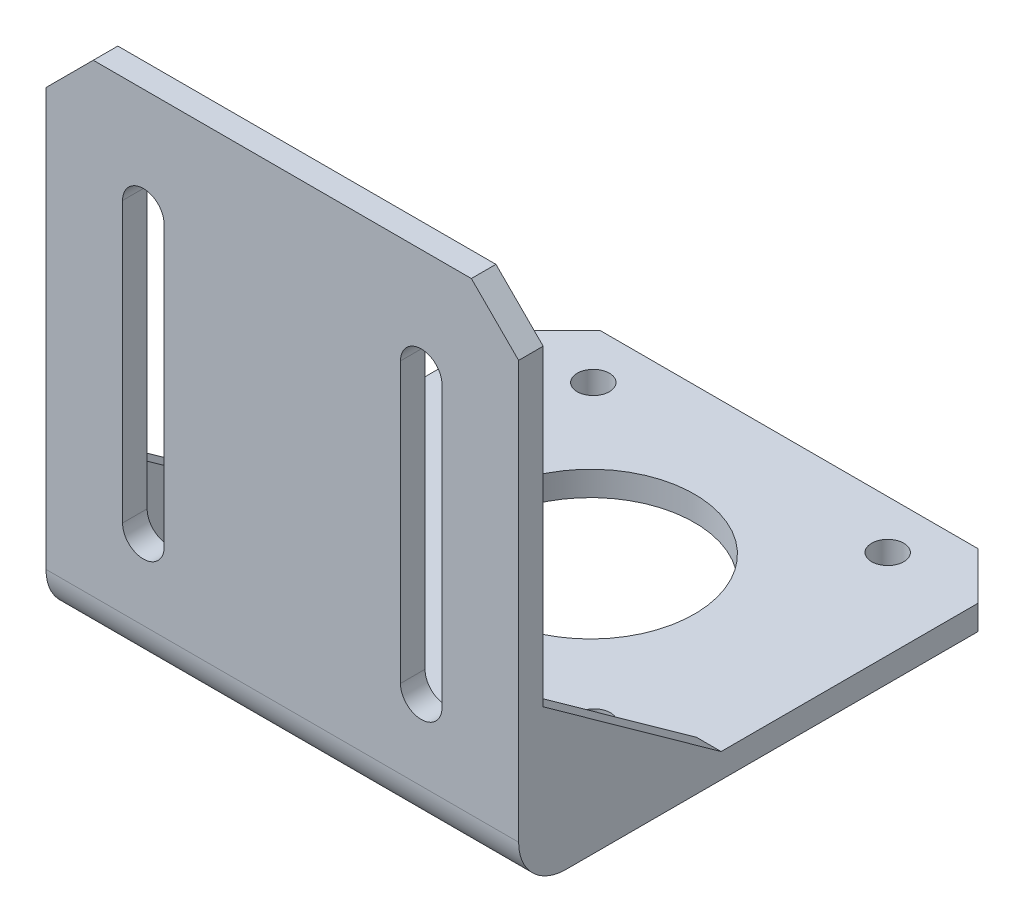
ISO-10303-21;
HEADER;
FILE_DESCRIPTION(('STEP AP214'),'2;1');
FILE_NAME('part.step','',(''),(''),'','','');
FILE_SCHEMA(('AUTOMOTIVE_DESIGN { 1 0 10303 214 1 1 1 1 }'));
ENDSEC;
DATA;
#1=APPLICATION_CONTEXT('core data for automotive mechanical design processes');
#2=APPLICATION_PROTOCOL_DEFINITION('international standard','automotive_design',2000,#1);
#3=PRODUCT_CONTEXT('',#1,'mechanical');
#4=PRODUCT('Part','Part','',(#3));
#5=PRODUCT_RELATED_PRODUCT_CATEGORY('part','',(#4));
#6=PRODUCT_DEFINITION_FORMATION('','',#4);
#7=PRODUCT_DEFINITION_CONTEXT('part definition',#1,'design');
#8=PRODUCT_DEFINITION('design','',#6,#7);
#9=PRODUCT_DEFINITION_SHAPE('','',#8);
#10=(LENGTH_UNIT() NAMED_UNIT(*) SI_UNIT(.MILLI.,.METRE.));
#11=(NAMED_UNIT(*) PLANE_ANGLE_UNIT() SI_UNIT($,.RADIAN.));
#12=(NAMED_UNIT(*) SI_UNIT($,.STERADIAN.) SOLID_ANGLE_UNIT());
#13=UNCERTAINTY_MEASURE_WITH_UNIT(LENGTH_MEASURE(1.E-05),#10,'distance_accuracy_value','');
#14=(GEOMETRIC_REPRESENTATION_CONTEXT(3) GLOBAL_UNCERTAINTY_ASSIGNED_CONTEXT((#13)) GLOBAL_UNIT_ASSIGNED_CONTEXT((#10,
#11,#12)) REPRESENTATION_CONTEXT('',''));
#15=CARTESIAN_POINT('',(0.,0.,0.));
#16=DIRECTION('',(0.,0.,1.));
#17=DIRECTION('',(1.,0.,0.));
#18=AXIS2_PLACEMENT_3D('',#15,#16,#17);
#19=CARTESIAN_POINT('',(0.,0.,0.));
#20=DIRECTION('',(0.,0.,-1.));
#21=DIRECTION('',(-1.,0.,0.));
#22=AXIS2_PLACEMENT_3D('',#19,#20,#21);
#23=PLANE('',#22);
#24=DIRECTION('',(0.,-1.,0.));
#25=VECTOR('',#24,1.);
#26=CARTESIAN_POINT('',(-16.9,15.775,0.));
#27=LINE('',#26,#25);
#28=CARTESIAN_POINT('',(-16.9,15.775,0.));
#29=VERTEX_POINT('',#28);
#30=CARTESIAN_POINT('',(-16.9,-13.775,0.));
#31=VERTEX_POINT('',#30);
#32=EDGE_CURVE('E298',#29,#31,#27,.T.);
#33=ORIENTED_EDGE('',*,*,#32,.T.);
#34=CARTESIAN_POINT('',(-14.7,-13.775,0.));
#35=DIRECTION('',(0.,0.,1.));
#36=DIRECTION('',(-1.,0.,0.));
#37=AXIS2_PLACEMENT_3D('',#34,#35,#36);
#38=CIRCLE('',#37,2.19999999999999);
#39=CARTESIAN_POINT('',(-12.5,-13.775,0.));
#40=VERTEX_POINT('',#39);
#41=EDGE_CURVE('E300',#31,#40,#38,.T.);
#42=ORIENTED_EDGE('',*,*,#41,.T.);
#43=DIRECTION('',(0.,1.,0.));
#44=VECTOR('',#43,1.);
#45=CARTESIAN_POINT('',(-12.5,15.775,0.));
#46=LINE('',#45,#44);
#47=CARTESIAN_POINT('',(-12.5,15.775,0.));
#48=VERTEX_POINT('',#47);
#49=EDGE_CURVE('E288',#40,#48,#46,.T.);
#50=ORIENTED_EDGE('',*,*,#49,.T.);
#51=CARTESIAN_POINT('',(-14.7,15.775,0.));
#52=DIRECTION('',(0.,0.,1.));
#53=DIRECTION('',(-1.,0.,0.));
#54=AXIS2_PLACEMENT_3D('',#51,#52,#53);
#55=CIRCLE('',#54,2.2);
#56=EDGE_CURVE('E284',#48,#29,#55,.T.);
#57=ORIENTED_EDGE('',*,*,#56,.T.);
#58=EDGE_LOOP('',(#33,#42,#50,#57));
#59=FACE_BOUND('',#58,.T.);
#60=DIRECTION('',(0.,-1.,0.));
#61=VECTOR('',#60,1.);
#62=CARTESIAN_POINT('',(12.5,15.775,0.));
#63=LINE('',#62,#61);
#64=CARTESIAN_POINT('',(12.5,15.775,0.));
#65=VERTEX_POINT('',#64);
#66=CARTESIAN_POINT('',(12.5,-13.775,0.));
#67=VERTEX_POINT('',#66);
#68=EDGE_CURVE('E328',#65,#67,#63,.T.);
#69=ORIENTED_EDGE('',*,*,#68,.T.);
#70=CARTESIAN_POINT('',(14.7,-13.775,0.));
#71=DIRECTION('',(0.,0.,1.));
#72=DIRECTION('',(1.,0.,0.));
#73=AXIS2_PLACEMENT_3D('',#70,#71,#72);
#74=CIRCLE('',#73,2.19999999999999);
#75=CARTESIAN_POINT('',(16.9,-13.775,0.));
#76=VERTEX_POINT('',#75);
#77=EDGE_CURVE('E330',#67,#76,#74,.T.);
#78=ORIENTED_EDGE('',*,*,#77,.T.);
#79=DIRECTION('',(0.,1.,0.));
#80=VECTOR('',#79,1.);
#81=CARTESIAN_POINT('',(16.9,15.775,0.));
#82=LINE('',#81,#80);
#83=CARTESIAN_POINT('',(16.9,15.775,0.));
#84=VERTEX_POINT('',#83);
#85=EDGE_CURVE('E318',#76,#84,#82,.T.);
#86=ORIENTED_EDGE('',*,*,#85,.T.);
#87=CARTESIAN_POINT('',(14.7,15.775,0.));
#88=DIRECTION('',(0.,0.,1.));
#89=DIRECTION('',(1.,0.,0.));
#90=AXIS2_PLACEMENT_3D('',#87,#88,#89);
#91=CIRCLE('',#90,2.2);
#92=EDGE_CURVE('E314',#84,#65,#91,.T.);
#93=ORIENTED_EDGE('',*,*,#92,.T.);
#94=EDGE_LOOP('',(#69,#78,#86,#93));
#95=FACE_BOUND('',#94,.T.);
#96=DIRECTION('',(0.,-1.,0.));
#97=VECTOR('',#96,1.);
#98=CARTESIAN_POINT('',(22.4,-9.97499999999999,0.));
#99=LINE('',#98,#97);
#100=CARTESIAN_POINT('',(22.4,-10.9658265989329,0.));
#101=VERTEX_POINT('',#100);
#102=CARTESIAN_POINT('',(22.4,-21.875,0.));
#103=VERTEX_POINT('',#102);
#104=EDGE_CURVE('E241',#101,#103,#99,.T.);
#105=ORIENTED_EDGE('',*,*,#104,.T.);
#106=DIRECTION('',(1.,0.,0.));
#107=VECTOR('',#106,1.);
#108=CARTESIAN_POINT('',(0.,-21.875,0.));
#109=LINE('',#108,#107);
#110=CARTESIAN_POINT('',(-22.4,-21.875,0.));
#111=VERTEX_POINT('',#110);
#112=EDGE_CURVE('E49',#103,#111,#109,.F.);
#113=ORIENTED_EDGE('',*,*,#112,.T.);
#114=DIRECTION('',(0.,-1.,0.));
#115=VECTOR('',#114,1.);
#116=CARTESIAN_POINT('',(-22.4,-9.97499999999999,0.));
#117=LINE('',#116,#115);
#118=CARTESIAN_POINT('',(-22.4,-10.9658265989329,0.));
#119=VERTEX_POINT('',#118);
#120=EDGE_CURVE('E246',#119,#111,#117,.T.);
#121=ORIENTED_EDGE('',*,*,#120,.F.);
#122=DIRECTION('',(-1.,0.,0.));
#123=VECTOR('',#122,1.);
#124=CARTESIAN_POINT('',(25.,-10.9658265989329,0.));
#125=LINE('',#124,#123);
#126=CARTESIAN_POINT('',(-25.,-10.9658265989329,0.));
#127=VERTEX_POINT('',#126);
#128=EDGE_CURVE('E224',#119,#127,#125,.T.);
#129=ORIENTED_EDGE('',*,*,#128,.T.);
#130=DIRECTION('',(0.,-1.,0.));
#131=VECTOR('',#130,1.);
#132=CARTESIAN_POINT('',(-25.,-27.075,0.));
#133=LINE('',#132,#131);
#134=CARTESIAN_POINT('',(-25.,22.075,0.));
#135=VERTEX_POINT('',#134);
#136=EDGE_CURVE('E344',#135,#127,#133,.T.);
#137=ORIENTED_EDGE('',*,*,#136,.F.);
#138=DIRECTION('',(-0.707106781186548,-0.707106781186547,0.));
#139=VECTOR('',#138,1.);
#140=CARTESIAN_POINT('',(-25.,22.075,0.));
#141=LINE('',#140,#139);
#142=CARTESIAN_POINT('',(-20.,27.075,0.));
#143=VERTEX_POINT('',#142);
#144=EDGE_CURVE('E349',#143,#135,#141,.T.);
#145=ORIENTED_EDGE('',*,*,#144,.F.);
#146=DIRECTION('',(-1.,0.,0.));
#147=VECTOR('',#146,1.);
#148=CARTESIAN_POINT('',(-20.,27.075,0.));
#149=LINE('',#148,#147);
#150=CARTESIAN_POINT('',(20.,27.075,0.));
#151=VERTEX_POINT('',#150);
#152=EDGE_CURVE('E363',#151,#143,#149,.T.);
#153=ORIENTED_EDGE('',*,*,#152,.F.);
#154=DIRECTION('',(-0.707106781186548,0.707106781186548,0.));
#155=VECTOR('',#154,1.);
#156=CARTESIAN_POINT('',(20.,27.075,0.));
#157=LINE('',#156,#155);
#158=CARTESIAN_POINT('',(25.,22.075,0.));
#159=VERTEX_POINT('',#158);
#160=EDGE_CURVE('E361',#159,#151,#157,.T.);
#161=ORIENTED_EDGE('',*,*,#160,.F.);
#162=DIRECTION('',(0.,1.,0.));
#163=VECTOR('',#162,1.);
#164=CARTESIAN_POINT('',(25.,-27.075,0.));
#165=LINE('',#164,#163);
#166=CARTESIAN_POINT('',(25.,-10.9658265989329,0.));
#167=VERTEX_POINT('',#166);
#168=EDGE_CURVE('E359',#167,#159,#165,.T.);
#169=ORIENTED_EDGE('',*,*,#168,.F.);
#170=EDGE_CURVE('E230',#167,#101,#125,.T.);
#171=ORIENTED_EDGE('',*,*,#170,.T.);
#172=EDGE_LOOP('',(#105,#113,#121,#129,#137,#145,#153,#161,#169,#171));
#173=FACE_BOUND('',#172,.T.);
#174=ADVANCED_FACE('F41',(#59,#95,#173),#23,.T.);
#175=CARTESIAN_POINT('',(25.,-24.475,-51.));
#176=DIRECTION('',(0.,-1.,0.));
#177=DIRECTION('',(0.,0.,-1.));
#178=AXIS2_PLACEMENT_3D('',#175,#176,#177);
#179=PLANE('',#178);
#180=CARTESIAN_POINT('',(0.,-24.475,-30.));
#181=DIRECTION('',(0.,1.,0.));
#182=DIRECTION('',(0.,0.,1.));
#183=AXIS2_PLACEMENT_3D('',#180,#181,#182);
#184=CIRCLE('',#183,11.);
#185=CARTESIAN_POINT('',(0.,-24.475,-19.));
#186=VERTEX_POINT('',#185);
#187=EDGE_CURVE('E252',#186,#186,#184,.T.);
#188=ORIENTED_EDGE('',*,*,#187,.F.);
#189=EDGE_LOOP('',(#188));
#190=FACE_BOUND('',#189,.T.);
#191=CARTESIAN_POINT('',(-15.575,-24.475,-14.725));
#192=DIRECTION('',(0.,1.,0.));
#193=DIRECTION('',(0.,0.,1.));
#194=AXIS2_PLACEMENT_3D('',#191,#192,#193);
#195=CIRCLE('',#194,1.7);
#196=CARTESIAN_POINT('',(-15.575,-24.475,-13.025));
#197=VERTEX_POINT('',#196);
#198=EDGE_CURVE('E268',#197,#197,#195,.T.);
#199=ORIENTED_EDGE('',*,*,#198,.F.);
#200=EDGE_LOOP('',(#199));
#201=FACE_BOUND('',#200,.T.);
#202=CARTESIAN_POINT('',(15.575,-24.475,-14.825));
#203=DIRECTION('',(0.,1.,0.));
#204=DIRECTION('',(0.,0.,1.));
#205=AXIS2_PLACEMENT_3D('',#202,#203,#204);
#206=CIRCLE('',#205,1.7);
#207=CARTESIAN_POINT('',(15.575,-24.475,-13.125));
#208=VERTEX_POINT('',#207);
#209=EDGE_CURVE('E262',#208,#208,#206,.T.);
#210=ORIENTED_EDGE('',*,*,#209,.F.);
#211=EDGE_LOOP('',(#210));
#212=FACE_BOUND('',#211,.T.);
#213=DIRECTION('',(0.,0.,-1.));
#214=VECTOR('',#213,1.);
#215=CARTESIAN_POINT('',(-22.4,-24.475,-20.));
#216=LINE('',#215,#214);
#217=CARTESIAN_POINT('',(-22.4,-24.475,-2.6));
#218=VERTEX_POINT('',#217);
#219=CARTESIAN_POINT('',(-22.4,-24.475,-18.8271899759138));
#220=VERTEX_POINT('',#219);
#221=EDGE_CURVE('E244',#218,#220,#216,.T.);
#222=ORIENTED_EDGE('',*,*,#221,.F.);
#223=DIRECTION('',(1.,0.,0.));
#224=VECTOR('',#223,1.);
#225=CARTESIAN_POINT('',(25.,-24.475,-2.6));
#226=LINE('',#225,#224);
#227=CARTESIAN_POINT('',(22.4,-24.475,-2.6));
#228=VERTEX_POINT('',#227);
#229=EDGE_CURVE('E410',#218,#228,#226,.T.);
#230=ORIENTED_EDGE('',*,*,#229,.T.);
#231=DIRECTION('',(0.,0.,1.));
#232=VECTOR('',#231,1.);
#233=CARTESIAN_POINT('',(22.4,-24.475,-20.));
#234=LINE('',#233,#232);
#235=CARTESIAN_POINT('',(22.4,-24.475,-18.8271899759138));
#236=VERTEX_POINT('',#235);
#237=EDGE_CURVE('E221',#236,#228,#234,.T.);
#238=ORIENTED_EDGE('',*,*,#237,.F.);
#239=DIRECTION('',(-1.,0.,0.));
#240=VECTOR('',#239,1.);
#241=CARTESIAN_POINT('',(25.,-24.475,-18.8271899759138));
#242=LINE('',#241,#240);
#243=CARTESIAN_POINT('',(25.,-24.475,-18.8271899759138));
#244=VERTEX_POINT('',#243);
#245=EDGE_CURVE('E216',#244,#236,#242,.T.);
#246=ORIENTED_EDGE('',*,*,#245,.F.);
#247=DIRECTION('',(0.,0.,1.));
#248=VECTOR('',#247,1.);
#249=CARTESIAN_POINT('',(25.,-24.475,-51.));
#250=LINE('',#249,#248);
#251=CARTESIAN_POINT('',(25.,-24.475,-46.));
#252=VERTEX_POINT('',#251);
#253=EDGE_CURVE('E202',#252,#244,#250,.T.);
#254=ORIENTED_EDGE('',*,*,#253,.F.);
#255=DIRECTION('',(-0.707106781186547,0.,-0.707106781186549));
#256=VECTOR('',#255,1.);
#257=CARTESIAN_POINT('',(20.,-24.475,-51.));
#258=LINE('',#257,#256);
#259=CARTESIAN_POINT('',(20.,-24.475,-51.));
#260=VERTEX_POINT('',#259);
#261=EDGE_CURVE('E397',#252,#260,#258,.T.);
#262=ORIENTED_EDGE('',*,*,#261,.T.);
#263=DIRECTION('',(1.,0.,0.));
#264=VECTOR('',#263,1.);
#265=CARTESIAN_POINT('',(25.,-24.475,-51.));
#266=LINE('',#265,#264);
#267=CARTESIAN_POINT('',(-20.,-24.475,-51.));
#268=VERTEX_POINT('',#267);
#269=EDGE_CURVE('E213',#268,#260,#266,.T.);
#270=ORIENTED_EDGE('',*,*,#269,.F.);
#271=DIRECTION('',(-0.707106781186547,0.,0.707106781186548));
#272=VECTOR('',#271,1.);
#273=CARTESIAN_POINT('',(-20.,-24.475,-51.));
#274=LINE('',#273,#272);
#275=CARTESIAN_POINT('',(-25.,-24.475,-46.));
#276=VERTEX_POINT('',#275);
#277=EDGE_CURVE('E399',#268,#276,#274,.T.);
#278=ORIENTED_EDGE('',*,*,#277,.T.);
#279=DIRECTION('',(0.,0.,1.));
#280=VECTOR('',#279,1.);
#281=CARTESIAN_POINT('',(-25.,-24.475,-51.));
#282=LINE('',#281,#280);
#283=CARTESIAN_POINT('',(-25.,-24.475,-18.8271899759138));
#284=VERTEX_POINT('',#283);
#285=EDGE_CURVE('E212',#276,#284,#282,.T.);
#286=ORIENTED_EDGE('',*,*,#285,.T.);
#287=EDGE_CURVE('E225',#220,#284,#242,.T.);
#288=ORIENTED_EDGE('',*,*,#287,.F.);
#289=EDGE_LOOP('',(#222,#230,#238,#246,#254,#262,#270,#278,#286,#288));
#290=FACE_BOUND('',#289,.T.);
#291=CARTESIAN_POINT('',(-15.575,-24.475,-45.875));
#292=DIRECTION('',(0.,1.,0.));
#293=DIRECTION('',(0.,0.,1.));
#294=AXIS2_PLACEMENT_3D('',#291,#292,#293);
#295=CIRCLE('',#294,1.7);
#296=CARTESIAN_POINT('',(-15.575,-24.475,-44.175));
#297=VERTEX_POINT('',#296);
#298=EDGE_CURVE('E249',#297,#297,#295,.T.);
#299=ORIENTED_EDGE('',*,*,#298,.F.);
#300=EDGE_LOOP('',(#299));
#301=FACE_BOUND('',#300,.T.);
#302=CARTESIAN_POINT('',(15.575,-24.475,-45.875));
#303=DIRECTION('',(0.,1.,0.));
#304=DIRECTION('',(0.,0.,1.));
#305=AXIS2_PLACEMENT_3D('',#302,#303,#304);
#306=CIRCLE('',#305,1.7);
#307=CARTESIAN_POINT('',(15.575,-24.475,-44.175));
#308=VERTEX_POINT('',#307);
#309=EDGE_CURVE('E256',#308,#308,#306,.T.);
#310=ORIENTED_EDGE('',*,*,#309,.F.);
#311=EDGE_LOOP('',(#310));
#312=FACE_BOUND('',#311,.T.);
#313=ADVANCED_FACE('F218',(#190,#201,#212,#290,#301,#312),#179,.F.);
#314=CARTESIAN_POINT('',(0.,0.,2.6));
#315=DIRECTION('',(0.,0.,-1.));
#316=DIRECTION('',(-1.,0.,0.));
#317=AXIS2_PLACEMENT_3D('',#314,#315,#316);
#318=PLANE('',#317);
#319=CARTESIAN_POINT('',(14.7,15.775,2.6));
#320=DIRECTION('',(0.,0.,1.));
#321=DIRECTION('',(1.,0.,0.));
#322=AXIS2_PLACEMENT_3D('',#319,#320,#321);
#323=CIRCLE('',#322,2.2);
#324=CARTESIAN_POINT('',(16.9,15.775,2.6));
#325=VERTEX_POINT('',#324);
#326=CARTESIAN_POINT('',(12.5,15.775,2.6));
#327=VERTEX_POINT('',#326);
#328=EDGE_CURVE('E315',#325,#327,#323,.T.);
#329=ORIENTED_EDGE('',*,*,#328,.F.);
#330=DIRECTION('',(0.,1.,0.));
#331=VECTOR('',#330,1.);
#332=CARTESIAN_POINT('',(16.9,15.775,2.6));
#333=LINE('',#332,#331);
#334=CARTESIAN_POINT('',(16.9,-13.775,2.6));
#335=VERTEX_POINT('',#334);
#336=EDGE_CURVE('E323',#335,#325,#333,.T.);
#337=ORIENTED_EDGE('',*,*,#336,.F.);
#338=CARTESIAN_POINT('',(14.7,-13.775,2.6));
#339=DIRECTION('',(0.,0.,1.));
#340=DIRECTION('',(1.,0.,0.));
#341=AXIS2_PLACEMENT_3D('',#338,#339,#340);
#342=CIRCLE('',#341,2.19999999999999);
#343=CARTESIAN_POINT('',(12.5,-13.775,2.6));
#344=VERTEX_POINT('',#343);
#345=EDGE_CURVE('E320',#344,#335,#342,.T.);
#346=ORIENTED_EDGE('',*,*,#345,.F.);
#347=DIRECTION('',(0.,-1.,0.));
#348=VECTOR('',#347,1.);
#349=CARTESIAN_POINT('',(12.5,15.775,2.6));
#350=LINE('',#349,#348);
#351=EDGE_CURVE('E317',#327,#344,#350,.T.);
#352=ORIENTED_EDGE('',*,*,#351,.F.);
#353=EDGE_LOOP('',(#329,#337,#346,#352));
#354=FACE_BOUND('',#353,.T.);
#355=DIRECTION('',(0.,-1.,0.));
#356=VECTOR('',#355,1.);
#357=CARTESIAN_POINT('',(-25.,-27.075,2.6));
#358=LINE('',#357,#356);
#359=CARTESIAN_POINT('',(-25.,22.075,2.6));
#360=VERTEX_POINT('',#359);
#361=CARTESIAN_POINT('',(-25.,-22.075,2.6));
#362=VERTEX_POINT('',#361);
#363=EDGE_CURVE('E345',#360,#362,#358,.T.);
#364=ORIENTED_EDGE('',*,*,#363,.T.);
#365=DIRECTION('',(1.,0.,0.));
#366=VECTOR('',#365,1.);
#367=CARTESIAN_POINT('',(0.,-22.075,2.6));
#368=LINE('',#367,#366);
#369=CARTESIAN_POINT('',(25.,-22.075,2.6));
#370=VERTEX_POINT('',#369);
#371=EDGE_CURVE('E382',#362,#370,#368,.T.);
#372=ORIENTED_EDGE('',*,*,#371,.T.);
#373=DIRECTION('',(0.,1.,0.));
#374=VECTOR('',#373,1.);
#375=CARTESIAN_POINT('',(25.,-27.075,2.6));
#376=LINE('',#375,#374);
#377=CARTESIAN_POINT('',(25.,22.075,2.6));
#378=VERTEX_POINT('',#377);
#379=EDGE_CURVE('E348',#370,#378,#376,.T.);
#380=ORIENTED_EDGE('',*,*,#379,.T.);
#381=DIRECTION('',(-0.707106781186548,0.707106781186548,0.));
#382=VECTOR('',#381,1.);
#383=CARTESIAN_POINT('',(20.,27.075,2.6));
#384=LINE('',#383,#382);
#385=CARTESIAN_POINT('',(20.,27.075,2.6));
#386=VERTEX_POINT('',#385);
#387=EDGE_CURVE('E351',#378,#386,#384,.T.);
#388=ORIENTED_EDGE('',*,*,#387,.T.);
#389=DIRECTION('',(-1.,0.,0.));
#390=VECTOR('',#389,1.);
#391=CARTESIAN_POINT('',(-20.,27.075,2.6));
#392=LINE('',#391,#390);
#393=CARTESIAN_POINT('',(-20.,27.075,2.6));
#394=VERTEX_POINT('',#393);
#395=EDGE_CURVE('E353',#386,#394,#392,.T.);
#396=ORIENTED_EDGE('',*,*,#395,.T.);
#397=DIRECTION('',(-0.707106781186548,-0.707106781186547,0.));
#398=VECTOR('',#397,1.);
#399=CARTESIAN_POINT('',(-25.,22.075,2.6));
#400=LINE('',#399,#398);
#401=EDGE_CURVE('E355',#394,#360,#400,.T.);
#402=ORIENTED_EDGE('',*,*,#401,.T.);
#403=EDGE_LOOP('',(#364,#372,#380,#388,#396,#402));
#404=FACE_BOUND('',#403,.T.);
#405=CARTESIAN_POINT('',(-14.7,15.775,2.6));
#406=DIRECTION('',(0.,0.,1.));
#407=DIRECTION('',(-1.,0.,0.));
#408=AXIS2_PLACEMENT_3D('',#405,#406,#407);
#409=CIRCLE('',#408,2.2);
#410=CARTESIAN_POINT('',(-12.5,15.775,2.6));
#411=VERTEX_POINT('',#410);
#412=CARTESIAN_POINT('',(-16.9,15.775,2.6));
#413=VERTEX_POINT('',#412);
#414=EDGE_CURVE('E285',#411,#413,#409,.T.);
#415=ORIENTED_EDGE('',*,*,#414,.F.);
#416=DIRECTION('',(0.,1.,0.));
#417=VECTOR('',#416,1.);
#418=CARTESIAN_POINT('',(-12.5,15.775,2.6));
#419=LINE('',#418,#417);
#420=CARTESIAN_POINT('',(-12.5,-13.775,2.6));
#421=VERTEX_POINT('',#420);
#422=EDGE_CURVE('E293',#421,#411,#419,.T.);
#423=ORIENTED_EDGE('',*,*,#422,.F.);
#424=CARTESIAN_POINT('',(-14.7,-13.775,2.6));
#425=DIRECTION('',(0.,0.,1.));
#426=DIRECTION('',(-1.,0.,0.));
#427=AXIS2_PLACEMENT_3D('',#424,#425,#426);
#428=CIRCLE('',#427,2.19999999999999);
#429=CARTESIAN_POINT('',(-16.9,-13.775,2.6));
#430=VERTEX_POINT('',#429);
#431=EDGE_CURVE('E290',#430,#421,#428,.T.);
#432=ORIENTED_EDGE('',*,*,#431,.F.);
#433=DIRECTION('',(0.,-1.,0.));
#434=VECTOR('',#433,1.);
#435=CARTESIAN_POINT('',(-16.9,15.775,2.6));
#436=LINE('',#435,#434);
#437=EDGE_CURVE('E287',#413,#430,#436,.T.);
#438=ORIENTED_EDGE('',*,*,#437,.F.);
#439=EDGE_LOOP('',(#415,#423,#432,#438));
#440=FACE_BOUND('',#439,.T.);
#441=ADVANCED_FACE('F427',(#354,#404,#440),#318,.F.);
#442=CARTESIAN_POINT('',(-25.,-27.075,2.6));
#443=DIRECTION('',(1.,0.,0.));
#444=DIRECTION('',(0.,1.,0.));
#445=AXIS2_PLACEMENT_3D('',#442,#443,#444);
#446=PLANE('',#445);
#447=ORIENTED_EDGE('',*,*,#136,.T.);
#448=DIRECTION('',(0.,0.582985114223599,0.812482834645568));
#449=VECTOR('',#448,1.);
#450=CARTESIAN_POINT('',(-25.,-24.475,-18.8271899759138));
#451=LINE('',#450,#449);
#452=EDGE_CURVE('E231',#284,#127,#451,.T.);
#453=ORIENTED_EDGE('',*,*,#452,.F.);
#454=ORIENTED_EDGE('',*,*,#285,.F.);
#455=DIRECTION('',(0.,-1.,0.));
#456=VECTOR('',#455,1.);
#457=CARTESIAN_POINT('',(-25.,-27.075,-46.));
#458=LINE('',#457,#456);
#459=CARTESIAN_POINT('',(-25.,-27.075,-46.));
#460=VERTEX_POINT('',#459);
#461=EDGE_CURVE('E401',#276,#460,#458,.T.);
#462=ORIENTED_EDGE('',*,*,#461,.T.);
#463=DIRECTION('',(0.,0.,-1.));
#464=VECTOR('',#463,1.);
#465=CARTESIAN_POINT('',(-25.,-27.075,2.6));
#466=LINE('',#465,#464);
#467=CARTESIAN_POINT('',(-25.,-27.075,-2.4));
#468=VERTEX_POINT('',#467);
#469=EDGE_CURVE('E379',#468,#460,#466,.T.);
#470=ORIENTED_EDGE('',*,*,#469,.F.);
#471=CARTESIAN_POINT('',(-25.,-22.075,-2.4));
#472=DIRECTION('',(1.,0.,0.));
#473=DIRECTION('',(0.,1.,0.));
#474=AXIS2_PLACEMENT_3D('',#471,#472,#473);
#475=CIRCLE('',#474,5.);
#476=EDGE_CURVE('E389',#468,#362,#475,.F.);
#477=ORIENTED_EDGE('',*,*,#476,.T.);
#478=ORIENTED_EDGE('',*,*,#363,.F.);
#479=DIRECTION('',(0.,0.,-1.));
#480=VECTOR('',#479,1.);
#481=CARTESIAN_POINT('',(-25.,22.075,2.6));
#482=LINE('',#481,#480);
#483=EDGE_CURVE('E357',#360,#135,#482,.T.);
#484=ORIENTED_EDGE('',*,*,#483,.T.);
#485=EDGE_LOOP('',(#447,#453,#454,#462,#470,#477,#478,#484));
#486=FACE_BOUND('',#485,.T.);
#487=ADVANCED_FACE('F442',(#486),#446,.F.);
#488=CARTESIAN_POINT('',(-25.,-27.075,2.6));
#489=DIRECTION('',(0.,1.,0.));
#490=DIRECTION('',(0.,0.,1.));
#491=AXIS2_PLACEMENT_3D('',#488,#489,#490);
#492=PLANE('',#491);
#493=CARTESIAN_POINT('',(-15.575,-27.075,-14.725));
#494=DIRECTION('',(0.,1.,0.));
#495=DIRECTION('',(0.,0.,1.));
#496=AXIS2_PLACEMENT_3D('',#493,#494,#495);
#497=CIRCLE('',#496,1.7);
#498=CARTESIAN_POINT('',(-15.575,-27.075,-13.025));
#499=VERTEX_POINT('',#498);
#500=EDGE_CURVE('E248',#499,#499,#497,.T.);
#501=ORIENTED_EDGE('',*,*,#500,.T.);
#502=EDGE_LOOP('',(#501));
#503=FACE_BOUND('',#502,.T.);
#504=CARTESIAN_POINT('',(15.575,-27.075,-14.825));
#505=DIRECTION('',(0.,1.,0.));
#506=DIRECTION('',(0.,0.,1.));
#507=AXIS2_PLACEMENT_3D('',#504,#505,#506);
#508=CIRCLE('',#507,1.7);
#509=CARTESIAN_POINT('',(15.575,-27.075,-13.125));
#510=VERTEX_POINT('',#509);
#511=EDGE_CURVE('E265',#510,#510,#508,.T.);
#512=ORIENTED_EDGE('',*,*,#511,.T.);
#513=EDGE_LOOP('',(#512));
#514=FACE_BOUND('',#513,.T.);
#515=CARTESIAN_POINT('',(15.575,-27.075,-45.875));
#516=DIRECTION('',(0.,1.,0.));
#517=DIRECTION('',(0.,0.,1.));
#518=AXIS2_PLACEMENT_3D('',#515,#516,#517);
#519=CIRCLE('',#518,1.7);
#520=CARTESIAN_POINT('',(15.575,-27.075,-44.175));
#521=VERTEX_POINT('',#520);
#522=EDGE_CURVE('E259',#521,#521,#519,.T.);
#523=ORIENTED_EDGE('',*,*,#522,.T.);
#524=EDGE_LOOP('',(#523));
#525=FACE_BOUND('',#524,.T.);
#526=CARTESIAN_POINT('',(-15.575,-27.075,-45.875));
#527=DIRECTION('',(0.,1.,0.));
#528=DIRECTION('',(0.,0.,1.));
#529=AXIS2_PLACEMENT_3D('',#526,#527,#528);
#530=CIRCLE('',#529,1.7);
#531=CARTESIAN_POINT('',(-15.575,-27.075,-44.175));
#532=VERTEX_POINT('',#531);
#533=EDGE_CURVE('E253',#532,#532,#530,.T.);
#534=ORIENTED_EDGE('',*,*,#533,.T.);
#535=EDGE_LOOP('',(#534));
#536=FACE_BOUND('',#535,.T.);
#537=CARTESIAN_POINT('',(0.,-27.075,-30.));
#538=DIRECTION('',(0.,1.,0.));
#539=DIRECTION('',(0.,0.,1.));
#540=AXIS2_PLACEMENT_3D('',#537,#538,#539);
#541=CIRCLE('',#540,11.);
#542=CARTESIAN_POINT('',(0.,-27.075,-19.));
#543=VERTEX_POINT('',#542);
#544=EDGE_CURVE('E273',#543,#543,#541,.T.);
#545=ORIENTED_EDGE('',*,*,#544,.T.);
#546=EDGE_LOOP('',(#545));
#547=FACE_BOUND('',#546,.T.);
#548=ORIENTED_EDGE('',*,*,#469,.T.);
#549=DIRECTION('',(0.707106781186547,0.,-0.707106781186548));
#550=VECTOR('',#549,1.);
#551=CARTESIAN_POINT('',(-20.,-27.075,-51.));
#552=LINE('',#551,#550);
#553=CARTESIAN_POINT('',(-20.,-27.075,-51.));
#554=VERTEX_POINT('',#553);
#555=EDGE_CURVE('E405',#460,#554,#552,.T.);
#556=ORIENTED_EDGE('',*,*,#555,.T.);
#557=DIRECTION('',(-1.,0.,0.));
#558=VECTOR('',#557,1.);
#559=CARTESIAN_POINT('',(25.,-27.075,-51.));
#560=LINE('',#559,#558);
#561=CARTESIAN_POINT('',(20.,-27.075,-51.));
#562=VERTEX_POINT('',#561);
#563=EDGE_CURVE('E276',#562,#554,#560,.T.);
#564=ORIENTED_EDGE('',*,*,#563,.F.);
#565=DIRECTION('',(0.707106781186547,0.,0.707106781186549));
#566=VECTOR('',#565,1.);
#567=CARTESIAN_POINT('',(20.,-27.075,-51.));
#568=LINE('',#567,#566);
#569=CARTESIAN_POINT('',(25.,-27.075,-46.));
#570=VERTEX_POINT('',#569);
#571=EDGE_CURVE('E403',#562,#570,#568,.T.);
#572=ORIENTED_EDGE('',*,*,#571,.T.);
#573=DIRECTION('',(0.,0.,-1.));
#574=VECTOR('',#573,1.);
#575=CARTESIAN_POINT('',(25.,-27.075,2.6));
#576=LINE('',#575,#574);
#577=CARTESIAN_POINT('',(25.,-27.075,-2.4));
#578=VERTEX_POINT('',#577);
#579=EDGE_CURVE('E377',#578,#570,#576,.T.);
#580=ORIENTED_EDGE('',*,*,#579,.F.);
#581=DIRECTION('',(1.,0.,0.));
#582=VECTOR('',#581,1.);
#583=CARTESIAN_POINT('',(-25.,-27.075,-2.4));
#584=LINE('',#583,#582);
#585=EDGE_CURVE('E387',#578,#468,#584,.F.);
#586=ORIENTED_EDGE('',*,*,#585,.T.);
#587=EDGE_LOOP('',(#548,#556,#564,#572,#580,#586));
#588=FACE_BOUND('',#587,.T.);
#589=ADVANCED_FACE('F435',(#503,#514,#525,#536,#547,#588),#492,.F.);
#590=CARTESIAN_POINT('',(25.,-27.075,2.6));
#591=DIRECTION('',(-1.,0.,0.));
#592=DIRECTION('',(0.,-1.,0.));
#593=AXIS2_PLACEMENT_3D('',#590,#591,#592);
#594=PLANE('',#593);
#595=DIRECTION('',(0.,0.582985114223599,0.812482834645568));
#596=VECTOR('',#595,1.);
#597=CARTESIAN_POINT('',(25.,-24.475,-18.8271899759138));
#598=LINE('',#597,#596);
#599=EDGE_CURVE('E206',#244,#167,#598,.T.);
#600=ORIENTED_EDGE('',*,*,#599,.T.);
#601=ORIENTED_EDGE('',*,*,#168,.T.);
#602=DIRECTION('',(0.,0.,-1.));
#603=VECTOR('',#602,1.);
#604=CARTESIAN_POINT('',(25.,22.075,2.6));
#605=LINE('',#604,#603);
#606=EDGE_CURVE('E374',#378,#159,#605,.T.);
#607=ORIENTED_EDGE('',*,*,#606,.F.);
#608=ORIENTED_EDGE('',*,*,#379,.F.);
#609=CARTESIAN_POINT('',(25.,-22.075,-2.4));
#610=DIRECTION('',(-1.,0.,0.));
#611=DIRECTION('',(0.,-1.,0.));
#612=AXIS2_PLACEMENT_3D('',#609,#610,#611);
#613=CIRCLE('',#612,5.);
#614=EDGE_CURVE('E385',#370,#578,#613,.F.);
#615=ORIENTED_EDGE('',*,*,#614,.T.);
#616=ORIENTED_EDGE('',*,*,#579,.T.);
#617=DIRECTION('',(0.,1.,0.));
#618=VECTOR('',#617,1.);
#619=CARTESIAN_POINT('',(25.,-24.475,-46.));
#620=LINE('',#619,#618);
#621=EDGE_CURVE('E209',#570,#252,#620,.T.);
#622=ORIENTED_EDGE('',*,*,#621,.T.);
#623=ORIENTED_EDGE('',*,*,#253,.T.);
#624=EDGE_LOOP('',(#600,#601,#607,#608,#615,#616,#622,#623));
#625=FACE_BOUND('',#624,.T.);
#626=ADVANCED_FACE('F204',(#625),#594,.F.);
#627=CARTESIAN_POINT('',(20.,27.075,2.6));
#628=DIRECTION('',(-0.707106781186548,-0.707106781186548,0.));
#629=DIRECTION('',(0.707106781186548,-0.707106781186548,0.));
#630=AXIS2_PLACEMENT_3D('',#627,#628,#629);
#631=PLANE('',#630);
#632=ORIENTED_EDGE('',*,*,#160,.T.);
#633=DIRECTION('',(0.,0.,-1.));
#634=VECTOR('',#633,1.);
#635=CARTESIAN_POINT('',(20.,27.075,2.6));
#636=LINE('',#635,#634);
#637=EDGE_CURVE('E371',#386,#151,#636,.T.);
#638=ORIENTED_EDGE('',*,*,#637,.F.);
#639=ORIENTED_EDGE('',*,*,#387,.F.);
#640=ORIENTED_EDGE('',*,*,#606,.T.);
#641=EDGE_LOOP('',(#632,#638,#639,#640));
#642=FACE_BOUND('',#641,.T.);
#643=ADVANCED_FACE('F423',(#642),#631,.F.);
#644=CARTESIAN_POINT('',(-20.,27.075,2.6));
#645=DIRECTION('',(0.,-1.,0.));
#646=DIRECTION('',(1.,0.,0.));
#647=AXIS2_PLACEMENT_3D('',#644,#645,#646);
#648=PLANE('',#647);
#649=ORIENTED_EDGE('',*,*,#152,.T.);
#650=DIRECTION('',(0.,0.,-1.));
#651=VECTOR('',#650,1.);
#652=CARTESIAN_POINT('',(-20.,27.075,2.6));
#653=LINE('',#652,#651);
#654=EDGE_CURVE('E368',#394,#143,#653,.T.);
#655=ORIENTED_EDGE('',*,*,#654,.F.);
#656=ORIENTED_EDGE('',*,*,#395,.F.);
#657=ORIENTED_EDGE('',*,*,#637,.T.);
#658=EDGE_LOOP('',(#649,#655,#656,#657));
#659=FACE_BOUND('',#658,.T.);
#660=ADVANCED_FACE('F492',(#659),#648,.F.);
#661=CARTESIAN_POINT('',(-25.,22.075,2.6));
#662=DIRECTION('',(0.707106781186547,-0.707106781186548,0.));
#663=DIRECTION('',(0.707106781186548,0.707106781186547,0.));
#664=AXIS2_PLACEMENT_3D('',#661,#662,#663);
#665=PLANE('',#664);
#666=ORIENTED_EDGE('',*,*,#144,.T.);
#667=ORIENTED_EDGE('',*,*,#483,.F.);
#668=ORIENTED_EDGE('',*,*,#401,.F.);
#669=ORIENTED_EDGE('',*,*,#654,.T.);
#670=EDGE_LOOP('',(#666,#667,#668,#669));
#671=FACE_BOUND('',#670,.T.);
#672=ADVANCED_FACE('F446',(#671),#665,.F.);
#673=CARTESIAN_POINT('',(14.7,15.775,2.6));
#674=DIRECTION('',(0.,0.,-1.));
#675=DIRECTION('',(-1.,0.,0.));
#676=AXIS2_PLACEMENT_3D('',#673,#674,#675);
#677=CYLINDRICAL_SURFACE('',#676,2.2);
#678=ORIENTED_EDGE('',*,*,#92,.F.);
#679=DIRECTION('',(0.,0.,-1.));
#680=VECTOR('',#679,1.);
#681=CARTESIAN_POINT('',(16.9,15.775,2.6));
#682=LINE('',#681,#680);
#683=EDGE_CURVE('E325',#325,#84,#682,.T.);
#684=ORIENTED_EDGE('',*,*,#683,.F.);
#685=ORIENTED_EDGE('',*,*,#328,.T.);
#686=DIRECTION('',(0.,0.,-1.));
#687=VECTOR('',#686,1.);
#688=CARTESIAN_POINT('',(12.5,15.775,2.6));
#689=LINE('',#688,#687);
#690=EDGE_CURVE('E341',#327,#65,#689,.T.);
#691=ORIENTED_EDGE('',*,*,#690,.T.);
#692=EDGE_LOOP('',(#678,#684,#685,#691));
#693=FACE_BOUND('',#692,.T.);
#694=ADVANCED_FACE('F491',(#693),#677,.F.);
#695=CARTESIAN_POINT('',(12.5,15.775,2.6));
#696=DIRECTION('',(1.,0.,0.));
#697=DIRECTION('',(0.,1.,0.));
#698=AXIS2_PLACEMENT_3D('',#695,#696,#697);
#699=PLANE('',#698);
#700=ORIENTED_EDGE('',*,*,#68,.F.);
#701=ORIENTED_EDGE('',*,*,#690,.F.);
#702=ORIENTED_EDGE('',*,*,#351,.T.);
#703=DIRECTION('',(0.,0.,-1.));
#704=VECTOR('',#703,1.);
#705=CARTESIAN_POINT('',(12.5,-13.775,2.6));
#706=LINE('',#705,#704);
#707=EDGE_CURVE('E338',#344,#67,#706,.T.);
#708=ORIENTED_EDGE('',*,*,#707,.T.);
#709=EDGE_LOOP('',(#700,#701,#702,#708));
#710=FACE_BOUND('',#709,.T.);
#711=ADVANCED_FACE('F547',(#710),#699,.T.);
#712=CARTESIAN_POINT('',(14.7,-13.775,2.6));
#713=DIRECTION('',(0.,0.,-1.));
#714=DIRECTION('',(-1.,0.,0.));
#715=AXIS2_PLACEMENT_3D('',#712,#713,#714);
#716=CYLINDRICAL_SURFACE('',#715,2.19999999999999);
#717=ORIENTED_EDGE('',*,*,#77,.F.);
#718=ORIENTED_EDGE('',*,*,#707,.F.);
#719=ORIENTED_EDGE('',*,*,#345,.T.);
#720=DIRECTION('',(0.,0.,-1.));
#721=VECTOR('',#720,1.);
#722=CARTESIAN_POINT('',(16.9,-13.775,2.6));
#723=LINE('',#722,#721);
#724=EDGE_CURVE('E336',#335,#76,#723,.T.);
#725=ORIENTED_EDGE('',*,*,#724,.T.);
#726=EDGE_LOOP('',(#717,#718,#719,#725));
#727=FACE_BOUND('',#726,.T.);
#728=ADVANCED_FACE('F543',(#727),#716,.F.);
#729=CARTESIAN_POINT('',(16.9,15.775,2.6));
#730=DIRECTION('',(-1.,0.,0.));
#731=DIRECTION('',(0.,-1.,0.));
#732=AXIS2_PLACEMENT_3D('',#729,#730,#731);
#733=PLANE('',#732);
#734=ORIENTED_EDGE('',*,*,#85,.F.);
#735=ORIENTED_EDGE('',*,*,#724,.F.);
#736=ORIENTED_EDGE('',*,*,#336,.T.);
#737=ORIENTED_EDGE('',*,*,#683,.T.);
#738=EDGE_LOOP('',(#734,#735,#736,#737));
#739=FACE_BOUND('',#738,.T.);
#740=ADVANCED_FACE('F539',(#739),#733,.T.);
#741=CARTESIAN_POINT('',(-14.7,15.775,2.6));
#742=DIRECTION('',(0.,0.,-1.));
#743=DIRECTION('',(-1.,0.,0.));
#744=AXIS2_PLACEMENT_3D('',#741,#742,#743);
#745=CYLINDRICAL_SURFACE('',#744,2.2);
#746=ORIENTED_EDGE('',*,*,#56,.F.);
#747=DIRECTION('',(0.,0.,-1.));
#748=VECTOR('',#747,1.);
#749=CARTESIAN_POINT('',(-12.5,15.775,2.6));
#750=LINE('',#749,#748);
#751=EDGE_CURVE('E295',#411,#48,#750,.T.);
#752=ORIENTED_EDGE('',*,*,#751,.F.);
#753=ORIENTED_EDGE('',*,*,#414,.T.);
#754=DIRECTION('',(0.,0.,-1.));
#755=VECTOR('',#754,1.);
#756=CARTESIAN_POINT('',(-16.9,15.775,2.6));
#757=LINE('',#756,#755);
#758=EDGE_CURVE('E311',#413,#29,#757,.T.);
#759=ORIENTED_EDGE('',*,*,#758,.T.);
#760=EDGE_LOOP('',(#746,#752,#753,#759));
#761=FACE_BOUND('',#760,.T.);
#762=ADVANCED_FACE('F535',(#761),#745,.F.);
#763=CARTESIAN_POINT('',(-16.9,15.775,2.6));
#764=DIRECTION('',(1.,0.,0.));
#765=DIRECTION('',(0.,1.,0.));
#766=AXIS2_PLACEMENT_3D('',#763,#764,#765);
#767=PLANE('',#766);
#768=ORIENTED_EDGE('',*,*,#32,.F.);
#769=ORIENTED_EDGE('',*,*,#758,.F.);
#770=ORIENTED_EDGE('',*,*,#437,.T.);
#771=DIRECTION('',(0.,0.,-1.));
#772=VECTOR('',#771,1.);
#773=CARTESIAN_POINT('',(-16.9,-13.775,2.6));
#774=LINE('',#773,#772);
#775=EDGE_CURVE('E308',#430,#31,#774,.T.);
#776=ORIENTED_EDGE('',*,*,#775,.T.);
#777=EDGE_LOOP('',(#768,#769,#770,#776));
#778=FACE_BOUND('',#777,.T.);
#779=ADVANCED_FACE('F531',(#778),#767,.T.);
#780=CARTESIAN_POINT('',(-14.7,-13.775,2.6));
#781=DIRECTION('',(0.,0.,-1.));
#782=DIRECTION('',(-1.,0.,0.));
#783=AXIS2_PLACEMENT_3D('',#780,#781,#782);
#784=CYLINDRICAL_SURFACE('',#783,2.19999999999999);
#785=ORIENTED_EDGE('',*,*,#41,.F.);
#786=ORIENTED_EDGE('',*,*,#775,.F.);
#787=ORIENTED_EDGE('',*,*,#431,.T.);
#788=DIRECTION('',(0.,0.,-1.));
#789=VECTOR('',#788,1.);
#790=CARTESIAN_POINT('',(-12.5,-13.775,2.6));
#791=LINE('',#790,#789);
#792=EDGE_CURVE('E306',#421,#40,#791,.T.);
#793=ORIENTED_EDGE('',*,*,#792,.T.);
#794=EDGE_LOOP('',(#785,#786,#787,#793));
#795=FACE_BOUND('',#794,.T.);
#796=ADVANCED_FACE('F524',(#795),#784,.F.);
#797=CARTESIAN_POINT('',(-12.5,15.775,2.6));
#798=DIRECTION('',(-1.,0.,0.));
#799=DIRECTION('',(0.,-1.,0.));
#800=AXIS2_PLACEMENT_3D('',#797,#798,#799);
#801=PLANE('',#800);
#802=ORIENTED_EDGE('',*,*,#49,.F.);
#803=ORIENTED_EDGE('',*,*,#792,.F.);
#804=ORIENTED_EDGE('',*,*,#422,.T.);
#805=ORIENTED_EDGE('',*,*,#751,.T.);
#806=EDGE_LOOP('',(#802,#803,#804,#805));
#807=FACE_BOUND('',#806,.T.);
#808=ADVANCED_FACE('F519',(#807),#801,.T.);
#809=CARTESIAN_POINT('',(0.,0.,-51.));
#810=DIRECTION('',(0.,0.,-1.));
#811=DIRECTION('',(-1.,0.,0.));
#812=AXIS2_PLACEMENT_3D('',#809,#810,#811);
#813=PLANE('',#812);
#814=ORIENTED_EDGE('',*,*,#563,.T.);
#815=DIRECTION('',(0.,1.,0.));
#816=VECTOR('',#815,1.);
#817=CARTESIAN_POINT('',(-20.,-24.475,-51.));
#818=LINE('',#817,#816);
#819=EDGE_CURVE('E394',#554,#268,#818,.T.);
#820=ORIENTED_EDGE('',*,*,#819,.T.);
#821=ORIENTED_EDGE('',*,*,#269,.T.);
#822=DIRECTION('',(0.,-1.,0.));
#823=VECTOR('',#822,1.);
#824=CARTESIAN_POINT('',(20.,-27.075,-51.));
#825=LINE('',#824,#823);
#826=EDGE_CURVE('E391',#260,#562,#825,.T.);
#827=ORIENTED_EDGE('',*,*,#826,.T.);
#828=EDGE_LOOP('',(#814,#820,#821,#827));
#829=FACE_BOUND('',#828,.T.);
#830=ADVANCED_FACE('F461',(#829),#813,.T.);
#831=CARTESIAN_POINT('',(0.,-22.075,-2.4));
#832=DIRECTION('',(1.,0.,0.));
#833=DIRECTION('',(0.,0.,-1.));
#834=AXIS2_PLACEMENT_3D('',#831,#832,#833);
#835=CYLINDRICAL_SURFACE('',#834,5.);
#836=ORIENTED_EDGE('',*,*,#476,.F.);
#837=ORIENTED_EDGE('',*,*,#585,.F.);
#838=ORIENTED_EDGE('',*,*,#614,.F.);
#839=ORIENTED_EDGE('',*,*,#371,.F.);
#840=EDGE_LOOP('',(#836,#837,#838,#839));
#841=FACE_BOUND('',#840,.T.);
#842=ADVANCED_FACE('F439',(#841),#835,.T.);
#843=CARTESIAN_POINT('',(0.,-27.075,-30.));
#844=DIRECTION('',(0.,1.,0.));
#845=DIRECTION('',(0.,0.,1.));
#846=AXIS2_PLACEMENT_3D('',#843,#844,#845);
#847=CYLINDRICAL_SURFACE('',#846,11.);
#848=ORIENTED_EDGE('',*,*,#544,.F.);
#849=EDGE_LOOP('',(#848));
#850=FACE_BOUND('',#849,.T.);
#851=ORIENTED_EDGE('',*,*,#187,.T.);
#852=EDGE_LOOP('',(#851));
#853=FACE_BOUND('',#852,.T.);
#854=ADVANCED_FACE('F506',(#850,#853),#847,.F.);
#855=CARTESIAN_POINT('',(-15.575,-27.075,-45.875));
#856=DIRECTION('',(0.,1.,0.));
#857=DIRECTION('',(0.,0.,1.));
#858=AXIS2_PLACEMENT_3D('',#855,#856,#857);
#859=CYLINDRICAL_SURFACE('',#858,1.7);
#860=ORIENTED_EDGE('',*,*,#533,.F.);
#861=EDGE_LOOP('',(#860));
#862=FACE_BOUND('',#861,.T.);
#863=ORIENTED_EDGE('',*,*,#298,.T.);
#864=EDGE_LOOP('',(#863));
#865=FACE_BOUND('',#864,.T.);
#866=ADVANCED_FACE('F516',(#862,#865),#859,.F.);
#867=CARTESIAN_POINT('',(15.575,-27.075,-45.875));
#868=DIRECTION('',(0.,1.,0.));
#869=DIRECTION('',(0.,0.,1.));
#870=AXIS2_PLACEMENT_3D('',#867,#868,#869);
#871=CYLINDRICAL_SURFACE('',#870,1.7);
#872=ORIENTED_EDGE('',*,*,#522,.F.);
#873=EDGE_LOOP('',(#872));
#874=FACE_BOUND('',#873,.T.);
#875=ORIENTED_EDGE('',*,*,#309,.T.);
#876=EDGE_LOOP('',(#875));
#877=FACE_BOUND('',#876,.T.);
#878=ADVANCED_FACE('F741',(#874,#877),#871,.F.);
#879=CARTESIAN_POINT('',(15.575,-27.075,-14.825));
#880=DIRECTION('',(0.,1.,0.));
#881=DIRECTION('',(0.,0.,1.));
#882=AXIS2_PLACEMENT_3D('',#879,#880,#881);
#883=CYLINDRICAL_SURFACE('',#882,1.7);
#884=ORIENTED_EDGE('',*,*,#511,.F.);
#885=EDGE_LOOP('',(#884));
#886=FACE_BOUND('',#885,.T.);
#887=ORIENTED_EDGE('',*,*,#209,.T.);
#888=EDGE_LOOP('',(#887));
#889=FACE_BOUND('',#888,.T.);
#890=ADVANCED_FACE('F733',(#886,#889),#883,.F.);
#891=CARTESIAN_POINT('',(-15.575,-27.075,-14.725));
#892=DIRECTION('',(0.,1.,0.));
#893=DIRECTION('',(0.,0.,1.));
#894=AXIS2_PLACEMENT_3D('',#891,#892,#893);
#895=CYLINDRICAL_SURFACE('',#894,1.7);
#896=ORIENTED_EDGE('',*,*,#500,.F.);
#897=EDGE_LOOP('',(#896));
#898=FACE_BOUND('',#897,.T.);
#899=ORIENTED_EDGE('',*,*,#198,.T.);
#900=EDGE_LOOP('',(#899));
#901=FACE_BOUND('',#900,.T.);
#902=ADVANCED_FACE('F474',(#898,#901),#895,.F.);
#903=CARTESIAN_POINT('',(-20.,0.,-51.));
#904=DIRECTION('',(-0.707106781186548,0.,-0.707106781186547));
#905=DIRECTION('',(0.,-1.,0.));
#906=AXIS2_PLACEMENT_3D('',#903,#904,#905);
#907=PLANE('',#906);
#908=ORIENTED_EDGE('',*,*,#555,.F.);
#909=ORIENTED_EDGE('',*,*,#461,.F.);
#910=ORIENTED_EDGE('',*,*,#277,.F.);
#911=ORIENTED_EDGE('',*,*,#819,.F.);
#912=EDGE_LOOP('',(#908,#909,#910,#911));
#913=FACE_BOUND('',#912,.T.);
#914=ADVANCED_FACE('F458',(#913),#907,.T.);
#915=CARTESIAN_POINT('',(20.,0.,-51.));
#916=DIRECTION('',(0.707106781186549,0.,-0.707106781186547));
#917=DIRECTION('',(0.,1.,0.));
#918=AXIS2_PLACEMENT_3D('',#915,#916,#917);
#919=PLANE('',#918);
#920=ORIENTED_EDGE('',*,*,#261,.F.);
#921=ORIENTED_EDGE('',*,*,#621,.F.);
#922=ORIENTED_EDGE('',*,*,#571,.F.);
#923=ORIENTED_EDGE('',*,*,#826,.F.);
#924=EDGE_LOOP('',(#920,#921,#922,#923));
#925=FACE_BOUND('',#924,.T.);
#926=ADVANCED_FACE('F465',(#925),#919,.T.);
#927=CARTESIAN_POINT('',(-22.4,-9.97499999999999,-20.));
#928=DIRECTION('',(-1.,0.,0.));
#929=DIRECTION('',(0.,0.,1.));
#930=AXIS2_PLACEMENT_3D('',#927,#928,#929);
#931=PLANE('',#930);
#932=ORIENTED_EDGE('',*,*,#120,.T.);
#933=CARTESIAN_POINT('',(-22.4,-21.875,-2.6));
#934=DIRECTION('',(-1.,0.,0.));
#935=DIRECTION('',(0.,0.,1.));
#936=AXIS2_PLACEMENT_3D('',#933,#934,#935);
#937=CIRCLE('',#936,2.6);
#938=EDGE_CURVE('E11',#111,#218,#937,.F.);
#939=ORIENTED_EDGE('',*,*,#938,.T.);
#940=ORIENTED_EDGE('',*,*,#221,.T.);
#941=DIRECTION('',(0.,0.582985114223599,0.812482834645568));
#942=VECTOR('',#941,1.);
#943=CARTESIAN_POINT('',(-22.4,-20.1023806976341,-12.7332468563823));
#944=LINE('',#943,#942);
#945=EDGE_CURVE('E237',#220,#119,#944,.T.);
#946=ORIENTED_EDGE('',*,*,#945,.T.);
#947=EDGE_LOOP('',(#932,#939,#940,#946));
#948=FACE_BOUND('',#947,.T.);
#949=ADVANCED_FACE('F467',(#948),#931,.F.);
#950=CARTESIAN_POINT('',(22.4,-9.97499999999999,-20.));
#951=DIRECTION('',(1.,0.,0.));
#952=DIRECTION('',(0.,0.,-1.));
#953=AXIS2_PLACEMENT_3D('',#950,#951,#952);
#954=PLANE('',#953);
#955=ORIENTED_EDGE('',*,*,#237,.T.);
#956=CARTESIAN_POINT('',(22.4,-21.875,-2.6));
#957=DIRECTION('',(1.,0.,0.));
#958=DIRECTION('',(0.,0.,-1.));
#959=AXIS2_PLACEMENT_3D('',#956,#957,#958);
#960=CIRCLE('',#959,2.6);
#961=EDGE_CURVE('E63',#228,#103,#960,.F.);
#962=ORIENTED_EDGE('',*,*,#961,.T.);
#963=ORIENTED_EDGE('',*,*,#104,.F.);
#964=DIRECTION('',(0.,-0.582985114223599,-0.812482834645568));
#965=VECTOR('',#964,1.);
#966=CARTESIAN_POINT('',(22.4,-20.1023806976341,-12.7332468563823));
#967=LINE('',#966,#965);
#968=EDGE_CURVE('E408',#101,#236,#967,.T.);
#969=ORIENTED_EDGE('',*,*,#968,.T.);
#970=EDGE_LOOP('',(#955,#962,#963,#969));
#971=FACE_BOUND('',#970,.T.);
#972=ADVANCED_FACE('F416',(#971),#954,.F.);
#973=CARTESIAN_POINT('',(25.,-24.475,-18.8271899759138));
#974=DIRECTION('',(0.,-0.812482834645568,0.582985114223599));
#975=DIRECTION('',(0.,-0.582985114223599,-0.812482834645568));
#976=AXIS2_PLACEMENT_3D('',#973,#974,#975);
#977=PLANE('',#976);
#978=ORIENTED_EDGE('',*,*,#170,.F.);
#979=ORIENTED_EDGE('',*,*,#599,.F.);
#980=ORIENTED_EDGE('',*,*,#245,.T.);
#981=ORIENTED_EDGE('',*,*,#968,.F.);
#982=EDGE_LOOP('',(#978,#979,#980,#981));
#983=FACE_BOUND('',#982,.T.);
#984=ADVANCED_FACE('F228',(#983),#977,.F.);
#985=ORIENTED_EDGE('',*,*,#287,.T.);
#986=ORIENTED_EDGE('',*,*,#452,.T.);
#987=ORIENTED_EDGE('',*,*,#128,.F.);
#988=ORIENTED_EDGE('',*,*,#945,.F.);
#989=EDGE_LOOP('',(#985,#986,#987,#988));
#990=FACE_BOUND('',#989,.T.);
#991=ADVANCED_FACE('F453',(#990),#977,.F.);
#992=CARTESIAN_POINT('',(25.,-21.875,-2.6));
#993=DIRECTION('',(1.,0.,0.));
#994=DIRECTION('',(0.,0.,-1.));
#995=AXIS2_PLACEMENT_3D('',#992,#993,#994);
#996=CYLINDRICAL_SURFACE('',#995,2.6);
#997=ORIENTED_EDGE('',*,*,#938,.F.);
#998=ORIENTED_EDGE('',*,*,#112,.F.);
#999=ORIENTED_EDGE('',*,*,#961,.F.);
#1000=ORIENTED_EDGE('',*,*,#229,.F.);
#1001=EDGE_LOOP('',(#997,#998,#999,#1000));
#1002=FACE_BOUND('',#1001,.T.);
#1003=ADVANCED_FACE('F43',(#1002),#996,.F.);
#1004=CLOSED_SHELL('',(#174,#313,#441,#487,#589,#626,#643,#660,#672,#694,#711,#728,#740,#762,
#779,#796,#808,#830,#842,#854,#866,#878,#890,#902,#914,#926,#949,#972,#984,#991,#1003));
#1005=MANIFOLD_SOLID_BREP('B2',#1004);
#1006=ADVANCED_BREP_SHAPE_REPRESENTATION('',(#18,#1005),#14);
#1007=SHAPE_DEFINITION_REPRESENTATION(#9,#1006);
ENDSEC;
END-ISO-10303-21;
